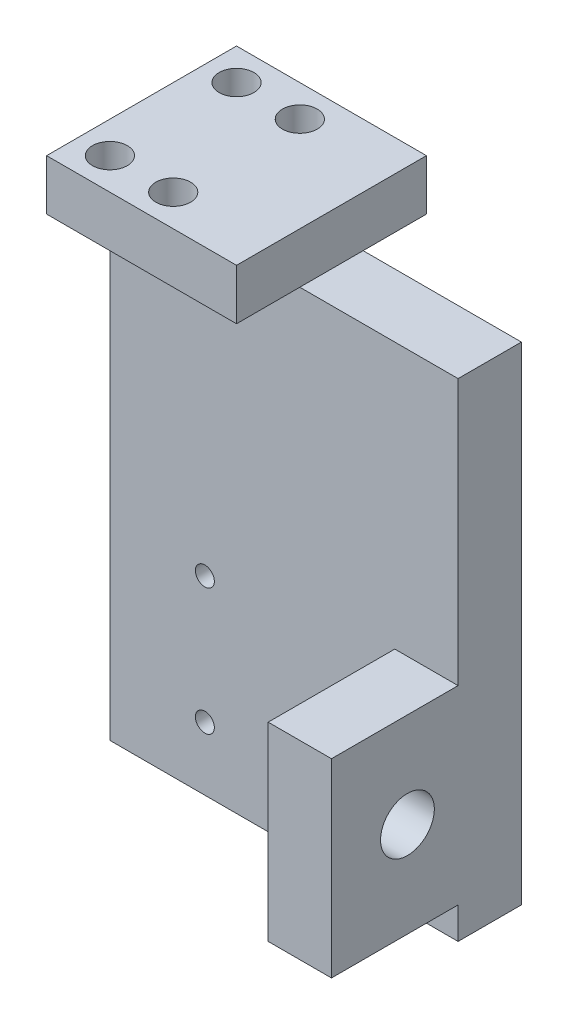
ISO-10303-21;
HEADER;
FILE_DESCRIPTION(('STEP AP214'),'2;1');
FILE_NAME('part.step','',(''),(''),'','','');
FILE_SCHEMA(('AUTOMOTIVE_DESIGN { 1 0 10303 214 1 1 1 1 }'));
ENDSEC;
DATA;
#1=APPLICATION_CONTEXT('core data for automotive mechanical design processes');
#2=APPLICATION_PROTOCOL_DEFINITION('international standard','automotive_design',2000,#1);
#3=PRODUCT_CONTEXT('',#1,'mechanical');
#4=PRODUCT('Part','Part','',(#3));
#5=PRODUCT_RELATED_PRODUCT_CATEGORY('part','',(#4));
#6=PRODUCT_DEFINITION_FORMATION('','',#4);
#7=PRODUCT_DEFINITION_CONTEXT('part definition',#1,'design');
#8=PRODUCT_DEFINITION('design','',#6,#7);
#9=PRODUCT_DEFINITION_SHAPE('','',#8);
#10=(LENGTH_UNIT() NAMED_UNIT(*) SI_UNIT(.MILLI.,.METRE.));
#11=(NAMED_UNIT(*) PLANE_ANGLE_UNIT() SI_UNIT($,.RADIAN.));
#12=(NAMED_UNIT(*) SI_UNIT($,.STERADIAN.) SOLID_ANGLE_UNIT());
#13=UNCERTAINTY_MEASURE_WITH_UNIT(LENGTH_MEASURE(1.E-05),#10,'distance_accuracy_value','');
#14=(GEOMETRIC_REPRESENTATION_CONTEXT(3) GLOBAL_UNCERTAINTY_ASSIGNED_CONTEXT((#13)) GLOBAL_UNIT_ASSIGNED_CONTEXT((#10,
#11,#12)) REPRESENTATION_CONTEXT('',''));
#15=CARTESIAN_POINT('',(0.,0.,0.));
#16=DIRECTION('',(0.,0.,1.));
#17=DIRECTION('',(1.,0.,0.));
#18=AXIS2_PLACEMENT_3D('',#15,#16,#17);
#19=CARTESIAN_POINT('',(5.,77.,25.));
#20=DIRECTION('',(0.,1.,0.));
#21=DIRECTION('',(0.,0.,1.));
#22=AXIS2_PLACEMENT_3D('',#19,#20,#21);
#23=CYLINDRICAL_SURFACE('',#22,2.75);
#24=CARTESIAN_POINT('',(5.,77.,25.));
#25=DIRECTION('',(0.,1.,0.));
#26=DIRECTION('',(0.,0.,1.));
#27=AXIS2_PLACEMENT_3D('',#24,#25,#26);
#28=CIRCLE('',#27,2.75);
#29=CARTESIAN_POINT('',(5.,77.,27.75));
#30=VERTEX_POINT('',#29);
#31=EDGE_CURVE('E144',#30,#30,#28,.F.);
#32=ORIENTED_EDGE('',*,*,#31,.T.);
#33=EDGE_LOOP('',(#32));
#34=FACE_BOUND('',#33,.T.);
#35=CARTESIAN_POINT('',(5.,85.,25.));
#36=DIRECTION('',(0.,1.,0.));
#37=DIRECTION('',(0.,0.,1.));
#38=AXIS2_PLACEMENT_3D('',#35,#36,#37);
#39=CIRCLE('',#38,2.75);
#40=CARTESIAN_POINT('',(5.,85.,27.75));
#41=VERTEX_POINT('',#40);
#42=EDGE_CURVE('E19',#41,#41,#39,.F.);
#43=ORIENTED_EDGE('',*,*,#42,.F.);
#44=EDGE_LOOP('',(#43));
#45=FACE_BOUND('',#44,.T.);
#46=ADVANCED_FACE('F16',(#34,#45),#23,.F.);
#47=CARTESIAN_POINT('',(15.,77.,25.));
#48=DIRECTION('',(0.,1.,0.));
#49=DIRECTION('',(0.,0.,1.));
#50=AXIS2_PLACEMENT_3D('',#47,#48,#49);
#51=CYLINDRICAL_SURFACE('',#50,2.75);
#52=CARTESIAN_POINT('',(15.,77.,25.));
#53=DIRECTION('',(0.,1.,0.));
#54=DIRECTION('',(0.,0.,1.));
#55=AXIS2_PLACEMENT_3D('',#52,#53,#54);
#56=CIRCLE('',#55,2.75);
#57=CARTESIAN_POINT('',(15.,77.,27.75));
#58=VERTEX_POINT('',#57);
#59=EDGE_CURVE('E125',#58,#58,#56,.F.);
#60=ORIENTED_EDGE('',*,*,#59,.T.);
#61=EDGE_LOOP('',(#60));
#62=FACE_BOUND('',#61,.T.);
#63=CARTESIAN_POINT('',(15.,85.,25.));
#64=DIRECTION('',(0.,1.,0.));
#65=DIRECTION('',(0.,0.,1.));
#66=AXIS2_PLACEMENT_3D('',#63,#64,#65);
#67=CIRCLE('',#66,2.75);
#68=CARTESIAN_POINT('',(15.,85.,27.75));
#69=VERTEX_POINT('',#68);
#70=EDGE_CURVE('E145',#69,#69,#67,.F.);
#71=ORIENTED_EDGE('',*,*,#70,.F.);
#72=EDGE_LOOP('',(#71));
#73=FACE_BOUND('',#72,.T.);
#74=ADVANCED_FACE('F191',(#62,#73),#51,.F.);
#75=CARTESIAN_POINT('',(45.,5.,40.));
#76=DIRECTION('',(0.,0.,1.));
#77=DIRECTION('',(1.,0.,0.));
#78=AXIS2_PLACEMENT_3D('',#75,#76,#77);
#79=PLANE('',#78);
#80=DIRECTION('',(0.,1.,0.));
#81=VECTOR('',#80,1.);
#82=CARTESIAN_POINT('',(55.,5.,40.));
#83=LINE('',#82,#81);
#84=CARTESIAN_POINT('',(55.,35.,40.));
#85=VERTEX_POINT('',#84);
#86=CARTESIAN_POINT('',(55.,5.,40.));
#87=VERTEX_POINT('',#86);
#88=EDGE_CURVE('E176',#85,#87,#83,.F.);
#89=ORIENTED_EDGE('',*,*,#88,.F.);
#90=DIRECTION('',(1.,0.,0.));
#91=VECTOR('',#90,1.);
#92=CARTESIAN_POINT('',(45.,35.,40.));
#93=LINE('',#92,#91);
#94=CARTESIAN_POINT('',(45.,35.,40.));
#95=VERTEX_POINT('',#94);
#96=EDGE_CURVE('E132',#95,#85,#93,.T.);
#97=ORIENTED_EDGE('',*,*,#96,.F.);
#98=DIRECTION('',(0.,1.,0.));
#99=VECTOR('',#98,1.);
#100=CARTESIAN_POINT('',(45.,5.,40.));
#101=LINE('',#100,#99);
#102=CARTESIAN_POINT('',(45.,5.,40.));
#103=VERTEX_POINT('',#102);
#104=EDGE_CURVE('E110',#95,#103,#101,.F.);
#105=ORIENTED_EDGE('',*,*,#104,.T.);
#106=DIRECTION('',(1.,0.,0.));
#107=VECTOR('',#106,1.);
#108=CARTESIAN_POINT('',(45.,5.,40.));
#109=LINE('',#108,#107);
#110=EDGE_CURVE('E116',#103,#87,#109,.T.);
#111=ORIENTED_EDGE('',*,*,#110,.T.);
#112=EDGE_LOOP('',(#89,#97,#105,#111));
#113=FACE_BOUND('',#112,.T.);
#114=ADVANCED_FACE('F131',(#113),#79,.T.);
#115=CARTESIAN_POINT('',(45.,20.,28.));
#116=DIRECTION('',(1.,0.,0.));
#117=DIRECTION('',(0.,0.,-1.));
#118=AXIS2_PLACEMENT_3D('',#115,#116,#117);
#119=CYLINDRICAL_SURFACE('',#118,4.25);
#120=CARTESIAN_POINT('',(45.,20.,28.));
#121=DIRECTION('',(1.,0.,0.));
#122=DIRECTION('',(0.,0.,-1.));
#123=AXIS2_PLACEMENT_3D('',#120,#121,#122);
#124=CIRCLE('',#123,4.25);
#125=CARTESIAN_POINT('',(45.,20.,23.75));
#126=VERTEX_POINT('',#125);
#127=EDGE_CURVE('E133',#126,#126,#124,.F.);
#128=ORIENTED_EDGE('',*,*,#127,.T.);
#129=EDGE_LOOP('',(#128));
#130=FACE_BOUND('',#129,.T.);
#131=CARTESIAN_POINT('',(55.,20.,28.));
#132=DIRECTION('',(1.,0.,0.));
#133=DIRECTION('',(0.,0.,-1.));
#134=AXIS2_PLACEMENT_3D('',#131,#132,#133);
#135=CIRCLE('',#134,4.25);
#136=CARTESIAN_POINT('',(55.,20.,23.75));
#137=VERTEX_POINT('',#136);
#138=EDGE_CURVE('E173',#137,#137,#135,.F.);
#139=ORIENTED_EDGE('',*,*,#138,.F.);
#140=EDGE_LOOP('',(#139));
#141=FACE_BOUND('',#140,.T.);
#142=ADVANCED_FACE('F273',(#130,#141),#119,.F.);
#143=CARTESIAN_POINT('',(0.,77.,30.));
#144=DIRECTION('',(0.,0.,1.));
#145=DIRECTION('',(1.,0.,0.));
#146=AXIS2_PLACEMENT_3D('',#143,#144,#145);
#147=PLANE('',#146);
#148=DIRECTION('',(0.,1.,0.));
#149=VECTOR('',#148,1.);
#150=CARTESIAN_POINT('',(30.,77.,30.));
#151=LINE('',#150,#149);
#152=CARTESIAN_POINT('',(30.,85.,30.));
#153=VERTEX_POINT('',#152);
#154=CARTESIAN_POINT('',(30.,77.,30.));
#155=VERTEX_POINT('',#154);
#156=EDGE_CURVE('E425',#153,#155,#151,.F.);
#157=ORIENTED_EDGE('',*,*,#156,.F.);
#158=DIRECTION('',(1.,0.,0.));
#159=VECTOR('',#158,1.);
#160=CARTESIAN_POINT('',(0.,85.,30.));
#161=LINE('',#160,#159);
#162=CARTESIAN_POINT('',(0.,85.,30.));
#163=VERTEX_POINT('',#162);
#164=EDGE_CURVE('E146',#163,#153,#161,.T.);
#165=ORIENTED_EDGE('',*,*,#164,.F.);
#166=DIRECTION('',(0.,1.,0.));
#167=VECTOR('',#166,1.);
#168=CARTESIAN_POINT('',(0.,77.,30.));
#169=LINE('',#168,#167);
#170=CARTESIAN_POINT('',(0.,77.,30.));
#171=VERTEX_POINT('',#170);
#172=EDGE_CURVE('E459',#163,#171,#169,.F.);
#173=ORIENTED_EDGE('',*,*,#172,.T.);
#174=DIRECTION('',(1.,0.,0.));
#175=VECTOR('',#174,1.);
#176=CARTESIAN_POINT('',(0.,77.,30.));
#177=LINE('',#176,#175);
#178=EDGE_CURVE('E141',#171,#155,#177,.T.);
#179=ORIENTED_EDGE('',*,*,#178,.T.);
#180=EDGE_LOOP('',(#157,#165,#173,#179));
#181=FACE_BOUND('',#180,.T.);
#182=ADVANCED_FACE('F270',(#181),#147,.T.);
#183=CARTESIAN_POINT('',(0.,85.,0.));
#184=DIRECTION('',(0.,1.,0.));
#185=DIRECTION('',(0.,0.,1.));
#186=AXIS2_PLACEMENT_3D('',#183,#184,#185);
#187=PLANE('',#186);
#188=ORIENTED_EDGE('',*,*,#70,.T.);
#189=EDGE_LOOP('',(#188));
#190=FACE_BOUND('',#189,.T.);
#191=CARTESIAN_POINT('',(15.,85.,5.));
#192=DIRECTION('',(0.,1.,0.));
#193=DIRECTION('',(0.,0.,1.));
#194=AXIS2_PLACEMENT_3D('',#191,#192,#193);
#195=CIRCLE('',#194,2.75);
#196=CARTESIAN_POINT('',(15.,85.,7.75));
#197=VERTEX_POINT('',#196);
#198=EDGE_CURVE('E165',#197,#197,#195,.F.);
#199=ORIENTED_EDGE('',*,*,#198,.T.);
#200=EDGE_LOOP('',(#199));
#201=FACE_BOUND('',#200,.T.);
#202=ORIENTED_EDGE('',*,*,#42,.T.);
#203=EDGE_LOOP('',(#202));
#204=FACE_BOUND('',#203,.T.);
#205=CARTESIAN_POINT('',(5.,85.,5.));
#206=DIRECTION('',(0.,1.,0.));
#207=DIRECTION('',(0.,0.,1.));
#208=AXIS2_PLACEMENT_3D('',#205,#206,#207);
#209=CIRCLE('',#208,2.75);
#210=CARTESIAN_POINT('',(5.,85.,7.75));
#211=VERTEX_POINT('',#210);
#212=EDGE_CURVE('E169',#211,#211,#209,.F.);
#213=ORIENTED_EDGE('',*,*,#212,.T.);
#214=EDGE_LOOP('',(#213));
#215=FACE_BOUND('',#214,.T.);
#216=ORIENTED_EDGE('',*,*,#164,.T.);
#217=DIRECTION('',(0.,0.,-1.));
#218=VECTOR('',#217,1.);
#219=CARTESIAN_POINT('',(30.,85.,0.));
#220=LINE('',#219,#218);
#221=CARTESIAN_POINT('',(30.,85.,0.));
#222=VERTEX_POINT('',#221);
#223=EDGE_CURVE('E175',#222,#153,#220,.F.);
#224=ORIENTED_EDGE('',*,*,#223,.F.);
#225=DIRECTION('',(1.,0.,0.));
#226=VECTOR('',#225,1.);
#227=CARTESIAN_POINT('',(0.,85.,0.));
#228=LINE('',#227,#226);
#229=CARTESIAN_POINT('',(0.,85.,0.));
#230=VERTEX_POINT('',#229);
#231=EDGE_CURVE('E467',#222,#230,#228,.F.);
#232=ORIENTED_EDGE('',*,*,#231,.T.);
#233=DIRECTION('',(0.,0.,-1.));
#234=VECTOR('',#233,1.);
#235=CARTESIAN_POINT('',(0.,85.,0.));
#236=LINE('',#235,#234);
#237=EDGE_CURVE('E461',#230,#163,#236,.F.);
#238=ORIENTED_EDGE('',*,*,#237,.T.);
#239=EDGE_LOOP('',(#216,#224,#232,#238));
#240=FACE_BOUND('',#239,.T.);
#241=ADVANCED_FACE('F187',(#190,#201,#204,#215,#240),#187,.T.);
#242=CARTESIAN_POINT('',(0.,77.,0.));
#243=DIRECTION('',(0.,1.,0.));
#244=DIRECTION('',(0.,0.,1.));
#245=AXIS2_PLACEMENT_3D('',#242,#243,#244);
#246=PLANE('',#245);
#247=ORIENTED_EDGE('',*,*,#59,.F.);
#248=EDGE_LOOP('',(#247));
#249=FACE_BOUND('',#248,.T.);
#250=ORIENTED_EDGE('',*,*,#31,.F.);
#251=EDGE_LOOP('',(#250));
#252=FACE_BOUND('',#251,.T.);
#253=DIRECTION('',(0.,0.,-1.));
#254=VECTOR('',#253,1.);
#255=CARTESIAN_POINT('',(0.,77.,0.));
#256=LINE('',#255,#254);
#257=CARTESIAN_POINT('',(0.,77.,20.));
#258=VERTEX_POINT('',#257);
#259=EDGE_CURVE('E172',#171,#258,#256,.T.);
#260=ORIENTED_EDGE('',*,*,#259,.T.);
#261=DIRECTION('',(1.,0.,0.));
#262=VECTOR('',#261,1.);
#263=CARTESIAN_POINT('',(0.,77.,20.));
#264=LINE('',#263,#262);
#265=CARTESIAN_POINT('',(30.,77.,20.));
#266=VERTEX_POINT('',#265);
#267=EDGE_CURVE('E168',#266,#258,#264,.F.);
#268=ORIENTED_EDGE('',*,*,#267,.F.);
#269=DIRECTION('',(0.,0.,-1.));
#270=VECTOR('',#269,1.);
#271=CARTESIAN_POINT('',(30.,77.,0.));
#272=LINE('',#271,#270);
#273=EDGE_CURVE('E430',#155,#266,#272,.T.);
#274=ORIENTED_EDGE('',*,*,#273,.F.);
#275=ORIENTED_EDGE('',*,*,#178,.F.);
#276=EDGE_LOOP('',(#260,#268,#274,#275));
#277=FACE_BOUND('',#276,.T.);
#278=ADVANCED_FACE('F264',(#249,#252,#277),#246,.F.);
#279=CARTESIAN_POINT('',(45.,5.,20.));
#280=DIRECTION('',(0.,1.,0.));
#281=DIRECTION('',(0.,0.,1.));
#282=AXIS2_PLACEMENT_3D('',#279,#280,#281);
#283=PLANE('',#282);
#284=ORIENTED_EDGE('',*,*,#110,.F.);
#285=DIRECTION('',(0.,0.,-1.));
#286=VECTOR('',#285,1.);
#287=CARTESIAN_POINT('',(45.,5.,20.));
#288=LINE('',#287,#286);
#289=CARTESIAN_POINT('',(45.,5.,20.));
#290=VERTEX_POINT('',#289);
#291=EDGE_CURVE('E119',#103,#290,#288,.T.);
#292=ORIENTED_EDGE('',*,*,#291,.T.);
#293=DIRECTION('',(1.,0.,0.));
#294=VECTOR('',#293,1.);
#295=CARTESIAN_POINT('',(0.,5.,20.));
#296=LINE('',#295,#294);
#297=CARTESIAN_POINT('',(55.,5.,20.));
#298=VERTEX_POINT('',#297);
#299=EDGE_CURVE('E451',#298,#290,#296,.F.);
#300=ORIENTED_EDGE('',*,*,#299,.F.);
#301=DIRECTION('',(0.,0.,-1.));
#302=VECTOR('',#301,1.);
#303=CARTESIAN_POINT('',(55.,5.,20.));
#304=LINE('',#303,#302);
#305=EDGE_CURVE('E121',#87,#298,#304,.T.);
#306=ORIENTED_EDGE('',*,*,#305,.F.);
#307=EDGE_LOOP('',(#284,#292,#300,#306));
#308=FACE_BOUND('',#307,.T.);
#309=ADVANCED_FACE('F117',(#308),#283,.F.);
#310=CARTESIAN_POINT('',(45.,5.,20.));
#311=DIRECTION('',(1.,0.,0.));
#312=DIRECTION('',(0.,0.,-1.));
#313=AXIS2_PLACEMENT_3D('',#310,#311,#312);
#314=PLANE('',#313);
#315=ORIENTED_EDGE('',*,*,#127,.F.);
#316=EDGE_LOOP('',(#315));
#317=FACE_BOUND('',#316,.T.);
#318=DIRECTION('',(0.,0.,1.));
#319=VECTOR('',#318,1.);
#320=CARTESIAN_POINT('',(45.,35.,20.));
#321=LINE('',#320,#319);
#322=CARTESIAN_POINT('',(45.,35.,20.));
#323=VERTEX_POINT('',#322);
#324=EDGE_CURVE('E136',#323,#95,#321,.T.);
#325=ORIENTED_EDGE('',*,*,#324,.F.);
#326=DIRECTION('',(0.,1.,0.));
#327=VECTOR('',#326,1.);
#328=CARTESIAN_POINT('',(45.,0.,20.));
#329=LINE('',#328,#327);
#330=EDGE_CURVE('E128',#290,#323,#329,.T.);
#331=ORIENTED_EDGE('',*,*,#330,.F.);
#332=ORIENTED_EDGE('',*,*,#291,.F.);
#333=ORIENTED_EDGE('',*,*,#104,.F.);
#334=EDGE_LOOP('',(#325,#331,#332,#333));
#335=FACE_BOUND('',#334,.T.);
#336=ADVANCED_FACE('F127',(#317,#335),#314,.F.);
#337=CARTESIAN_POINT('',(45.,35.,20.));
#338=DIRECTION('',(0.,1.,0.));
#339=DIRECTION('',(0.,0.,1.));
#340=AXIS2_PLACEMENT_3D('',#337,#338,#339);
#341=PLANE('',#340);
#342=ORIENTED_EDGE('',*,*,#96,.T.);
#343=DIRECTION('',(0.,0.,-1.));
#344=VECTOR('',#343,1.);
#345=CARTESIAN_POINT('',(55.,35.,20.));
#346=LINE('',#345,#344);
#347=CARTESIAN_POINT('',(55.,35.,20.));
#348=VERTEX_POINT('',#347);
#349=EDGE_CURVE('E438',#348,#85,#346,.F.);
#350=ORIENTED_EDGE('',*,*,#349,.F.);
#351=DIRECTION('',(1.,0.,0.));
#352=VECTOR('',#351,1.);
#353=CARTESIAN_POINT('',(0.,35.,20.));
#354=LINE('',#353,#352);
#355=EDGE_CURVE('E443',#323,#348,#354,.T.);
#356=ORIENTED_EDGE('',*,*,#355,.F.);
#357=ORIENTED_EDGE('',*,*,#324,.T.);
#358=EDGE_LOOP('',(#342,#350,#356,#357));
#359=FACE_BOUND('',#358,.T.);
#360=ADVANCED_FACE('F254',(#359),#341,.T.);
#361=CARTESIAN_POINT('',(30.,77.,0.));
#362=DIRECTION('',(1.,0.,0.));
#363=DIRECTION('',(0.,0.,-1.));
#364=AXIS2_PLACEMENT_3D('',#361,#362,#363);
#365=PLANE('',#364);
#366=ORIENTED_EDGE('',*,*,#273,.T.);
#367=DIRECTION('',(0.,0.,1.));
#368=VECTOR('',#367,1.);
#369=CARTESIAN_POINT('',(30.,77.,10.));
#370=LINE('',#369,#368);
#371=CARTESIAN_POINT('',(30.,77.,10.));
#372=VERTEX_POINT('',#371);
#373=EDGE_CURVE('E483',#372,#266,#370,.T.);
#374=ORIENTED_EDGE('',*,*,#373,.F.);
#375=DIRECTION('',(0.,0.,1.));
#376=VECTOR('',#375,1.);
#377=CARTESIAN_POINT('',(30.,77.,0.));
#378=LINE('',#377,#376);
#379=CARTESIAN_POINT('',(30.,77.,0.));
#380=VERTEX_POINT('',#379);
#381=EDGE_CURVE('E34',#372,#380,#378,.F.);
#382=ORIENTED_EDGE('',*,*,#381,.T.);
#383=DIRECTION('',(0.,1.,0.));
#384=VECTOR('',#383,1.);
#385=CARTESIAN_POINT('',(30.,77.,0.));
#386=LINE('',#385,#384);
#387=EDGE_CURVE('E432',#380,#222,#386,.T.);
#388=ORIENTED_EDGE('',*,*,#387,.T.);
#389=ORIENTED_EDGE('',*,*,#223,.T.);
#390=ORIENTED_EDGE('',*,*,#156,.T.);
#391=EDGE_LOOP('',(#366,#374,#382,#388,#389,#390));
#392=FACE_BOUND('',#391,.T.);
#393=ADVANCED_FACE('F250',(#392),#365,.T.);
#394=CARTESIAN_POINT('',(0.,77.,0.));
#395=DIRECTION('',(0.,0.,1.));
#396=DIRECTION('',(1.,0.,0.));
#397=AXIS2_PLACEMENT_3D('',#394,#395,#396);
#398=PLANE('',#397);
#399=ORIENTED_EDGE('',*,*,#387,.F.);
#400=DIRECTION('',(1.,0.,0.));
#401=VECTOR('',#400,1.);
#402=CARTESIAN_POINT('',(0.,77.,0.));
#403=LINE('',#402,#401);
#404=CARTESIAN_POINT('',(0.,77.,0.));
#405=VERTEX_POINT('',#404);
#406=EDGE_CURVE('E471',#380,#405,#403,.F.);
#407=ORIENTED_EDGE('',*,*,#406,.T.);
#408=DIRECTION('',(0.,1.,0.));
#409=VECTOR('',#408,1.);
#410=CARTESIAN_POINT('',(0.,77.,0.));
#411=LINE('',#410,#409);
#412=EDGE_CURVE('E464',#405,#230,#411,.T.);
#413=ORIENTED_EDGE('',*,*,#412,.T.);
#414=ORIENTED_EDGE('',*,*,#231,.F.);
#415=EDGE_LOOP('',(#399,#407,#413,#414));
#416=FACE_BOUND('',#415,.T.);
#417=ADVANCED_FACE('F246',(#416),#398,.F.);
#418=CARTESIAN_POINT('',(5.,77.,5.));
#419=DIRECTION('',(0.,1.,0.));
#420=DIRECTION('',(0.,0.,1.));
#421=AXIS2_PLACEMENT_3D('',#418,#419,#420);
#422=CYLINDRICAL_SURFACE('',#421,2.75);
#423=CARTESIAN_POINT('',(5.,77.,5.));
#424=DIRECTION('',(0.,1.,0.));
#425=DIRECTION('',(0.,0.,1.));
#426=AXIS2_PLACEMENT_3D('',#423,#424,#425);
#427=CIRCLE('',#426,2.75);
#428=CARTESIAN_POINT('',(5.,77.,7.75));
#429=VERTEX_POINT('',#428);
#430=EDGE_CURVE('E161',#429,#429,#427,.F.);
#431=ORIENTED_EDGE('',*,*,#430,.T.);
#432=EDGE_LOOP('',(#431));
#433=FACE_BOUND('',#432,.T.);
#434=ORIENTED_EDGE('',*,*,#212,.F.);
#435=EDGE_LOOP('',(#434));
#436=FACE_BOUND('',#435,.T.);
#437=ADVANCED_FACE('F242',(#433,#436),#422,.F.);
#438=CARTESIAN_POINT('',(15.,77.,5.));
#439=DIRECTION('',(0.,1.,0.));
#440=DIRECTION('',(0.,0.,1.));
#441=AXIS2_PLACEMENT_3D('',#438,#439,#440);
#442=CYLINDRICAL_SURFACE('',#441,2.75);
#443=CARTESIAN_POINT('',(15.,77.,5.));
#444=DIRECTION('',(0.,1.,0.));
#445=DIRECTION('',(0.,0.,1.));
#446=AXIS2_PLACEMENT_3D('',#443,#444,#445);
#447=CIRCLE('',#446,2.75);
#448=CARTESIAN_POINT('',(15.,77.,7.75));
#449=VERTEX_POINT('',#448);
#450=EDGE_CURVE('E158',#449,#449,#447,.F.);
#451=ORIENTED_EDGE('',*,*,#450,.T.);
#452=EDGE_LOOP('',(#451));
#453=FACE_BOUND('',#452,.T.);
#454=ORIENTED_EDGE('',*,*,#198,.F.);
#455=EDGE_LOOP('',(#454));
#456=FACE_BOUND('',#455,.T.);
#457=ADVANCED_FACE('F238',(#453,#456),#442,.F.);
#458=CARTESIAN_POINT('',(0.,0.,20.));
#459=DIRECTION('',(0.,0.,1.));
#460=DIRECTION('',(1.,0.,0.));
#461=AXIS2_PLACEMENT_3D('',#458,#459,#460);
#462=PLANE('',#461);
#463=CARTESIAN_POINT('',(15.,30.,20.));
#464=DIRECTION('',(0.,0.,1.));
#465=DIRECTION('',(1.,0.,0.));
#466=AXIS2_PLACEMENT_3D('',#463,#464,#465);
#467=CIRCLE('',#466,1.5);
#468=CARTESIAN_POINT('',(16.5,30.,20.));
#469=VERTEX_POINT('',#468);
#470=EDGE_CURVE('E151',#469,#469,#467,.F.);
#471=ORIENTED_EDGE('',*,*,#470,.T.);
#472=EDGE_LOOP('',(#471));
#473=FACE_BOUND('',#472,.T.);
#474=CARTESIAN_POINT('',(15.,10.,20.));
#475=DIRECTION('',(0.,0.,1.));
#476=DIRECTION('',(1.,0.,0.));
#477=AXIS2_PLACEMENT_3D('',#474,#475,#476);
#478=CIRCLE('',#477,1.5);
#479=CARTESIAN_POINT('',(16.5,10.,20.));
#480=VERTEX_POINT('',#479);
#481=EDGE_CURVE('E155',#480,#480,#478,.F.);
#482=ORIENTED_EDGE('',*,*,#481,.T.);
#483=EDGE_LOOP('',(#482));
#484=FACE_BOUND('',#483,.T.);
#485=DIRECTION('',(0.,1.,0.));
#486=VECTOR('',#485,1.);
#487=CARTESIAN_POINT('',(55.,0.,20.));
#488=LINE('',#487,#486);
#489=CARTESIAN_POINT('',(55.,77.,20.));
#490=VERTEX_POINT('',#489);
#491=EDGE_CURVE('E489',#490,#348,#488,.F.);
#492=ORIENTED_EDGE('',*,*,#491,.F.);
#493=DIRECTION('',(1.,0.,0.));
#494=VECTOR('',#493,1.);
#495=CARTESIAN_POINT('',(0.,77.,20.));
#496=LINE('',#495,#494);
#497=EDGE_CURVE('E481',#266,#490,#496,.T.);
#498=ORIENTED_EDGE('',*,*,#497,.F.);
#499=ORIENTED_EDGE('',*,*,#267,.T.);
#500=DIRECTION('',(0.,1.,0.));
#501=VECTOR('',#500,1.);
#502=CARTESIAN_POINT('',(0.,0.,20.));
#503=LINE('',#502,#501);
#504=CARTESIAN_POINT('',(0.,0.,20.));
#505=VERTEX_POINT('',#504);
#506=EDGE_CURVE('E447',#258,#505,#503,.F.);
#507=ORIENTED_EDGE('',*,*,#506,.T.);
#508=DIRECTION('',(1.,0.,0.));
#509=VECTOR('',#508,1.);
#510=CARTESIAN_POINT('',(0.,0.,20.));
#511=LINE('',#510,#509);
#512=CARTESIAN_POINT('',(55.,0.,20.));
#513=VERTEX_POINT('',#512);
#514=EDGE_CURVE('E493',#505,#513,#511,.T.);
#515=ORIENTED_EDGE('',*,*,#514,.T.);
#516=DIRECTION('',(0.,1.,0.));
#517=VECTOR('',#516,1.);
#518=CARTESIAN_POINT('',(55.,0.,20.));
#519=LINE('',#518,#517);
#520=EDGE_CURVE('E486',#298,#513,#519,.F.);
#521=ORIENTED_EDGE('',*,*,#520,.F.);
#522=ORIENTED_EDGE('',*,*,#299,.T.);
#523=ORIENTED_EDGE('',*,*,#330,.T.);
#524=ORIENTED_EDGE('',*,*,#355,.T.);
#525=EDGE_LOOP('',(#492,#498,#499,#507,#515,#521,#522,#523,#524));
#526=FACE_BOUND('',#525,.T.);
#527=ADVANCED_FACE('F234',(#473,#484,#526),#462,.T.);
#528=CARTESIAN_POINT('',(0.,0.,10.));
#529=DIRECTION('',(1.,0.,0.));
#530=DIRECTION('',(0.,0.,-1.));
#531=AXIS2_PLACEMENT_3D('',#528,#529,#530);
#532=PLANE('',#531);
#533=ORIENTED_EDGE('',*,*,#506,.F.);
#534=ORIENTED_EDGE('',*,*,#259,.F.);
#535=ORIENTED_EDGE('',*,*,#172,.F.);
#536=ORIENTED_EDGE('',*,*,#237,.F.);
#537=ORIENTED_EDGE('',*,*,#412,.F.);
#538=DIRECTION('',(0.,0.,1.));
#539=VECTOR('',#538,1.);
#540=CARTESIAN_POINT('',(0.,77.,0.));
#541=LINE('',#540,#539);
#542=CARTESIAN_POINT('',(0.,77.,10.));
#543=VERTEX_POINT('',#542);
#544=EDGE_CURVE('E164',#405,#543,#541,.T.);
#545=ORIENTED_EDGE('',*,*,#544,.T.);
#546=DIRECTION('',(0.,1.,0.));
#547=VECTOR('',#546,1.);
#548=CARTESIAN_POINT('',(0.,0.,10.));
#549=LINE('',#548,#547);
#550=CARTESIAN_POINT('',(0.,0.,10.));
#551=VERTEX_POINT('',#550);
#552=EDGE_CURVE('E154',#543,#551,#549,.F.);
#553=ORIENTED_EDGE('',*,*,#552,.T.);
#554=DIRECTION('',(0.,0.,1.));
#555=VECTOR('',#554,1.);
#556=CARTESIAN_POINT('',(0.,0.,10.));
#557=LINE('',#556,#555);
#558=EDGE_CURVE('E449',#551,#505,#557,.T.);
#559=ORIENTED_EDGE('',*,*,#558,.T.);
#560=EDGE_LOOP('',(#533,#534,#535,#536,#537,#545,#553,#559));
#561=FACE_BOUND('',#560,.T.);
#562=ADVANCED_FACE('F230',(#561),#532,.F.);
#563=CARTESIAN_POINT('',(0.,0.,10.));
#564=DIRECTION('',(0.,1.,0.));
#565=DIRECTION('',(0.,0.,1.));
#566=AXIS2_PLACEMENT_3D('',#563,#564,#565);
#567=PLANE('',#566);
#568=ORIENTED_EDGE('',*,*,#514,.F.);
#569=ORIENTED_EDGE('',*,*,#558,.F.);
#570=DIRECTION('',(1.,0.,0.));
#571=VECTOR('',#570,1.);
#572=CARTESIAN_POINT('',(0.,0.,10.));
#573=LINE('',#572,#571);
#574=CARTESIAN_POINT('',(55.,0.,10.));
#575=VERTEX_POINT('',#574);
#576=EDGE_CURVE('E502',#551,#575,#573,.T.);
#577=ORIENTED_EDGE('',*,*,#576,.T.);
#578=DIRECTION('',(0.,0.,-1.));
#579=VECTOR('',#578,1.);
#580=CARTESIAN_POINT('',(55.,0.,10.));
#581=LINE('',#580,#579);
#582=EDGE_CURVE('E491',#513,#575,#581,.T.);
#583=ORIENTED_EDGE('',*,*,#582,.F.);
#584=EDGE_LOOP('',(#568,#569,#577,#583));
#585=FACE_BOUND('',#584,.T.);
#586=ADVANCED_FACE('F226',(#585),#567,.F.);
#587=CARTESIAN_POINT('',(55.,0.,10.));
#588=DIRECTION('',(1.,0.,0.));
#589=DIRECTION('',(0.,0.,-1.));
#590=AXIS2_PLACEMENT_3D('',#587,#588,#589);
#591=PLANE('',#590);
#592=ORIENTED_EDGE('',*,*,#491,.T.);
#593=ORIENTED_EDGE('',*,*,#349,.T.);
#594=ORIENTED_EDGE('',*,*,#88,.T.);
#595=ORIENTED_EDGE('',*,*,#305,.T.);
#596=ORIENTED_EDGE('',*,*,#520,.T.);
#597=ORIENTED_EDGE('',*,*,#582,.T.);
#598=DIRECTION('',(0.,1.,0.));
#599=VECTOR('',#598,1.);
#600=CARTESIAN_POINT('',(55.,0.,10.));
#601=LINE('',#600,#599);
#602=CARTESIAN_POINT('',(55.,77.,10.));
#603=VERTEX_POINT('',#602);
#604=EDGE_CURVE('E508',#575,#603,#601,.T.);
#605=ORIENTED_EDGE('',*,*,#604,.T.);
#606=DIRECTION('',(0.,0.,1.));
#607=VECTOR('',#606,1.);
#608=CARTESIAN_POINT('',(55.,77.,10.));
#609=LINE('',#608,#607);
#610=EDGE_CURVE('E476',#490,#603,#609,.F.);
#611=ORIENTED_EDGE('',*,*,#610,.F.);
#612=EDGE_LOOP('',(#592,#593,#594,#595,#596,#597,#605,#611));
#613=FACE_BOUND('',#612,.T.);
#614=ORIENTED_EDGE('',*,*,#138,.T.);
#615=EDGE_LOOP('',(#614));
#616=FACE_BOUND('',#615,.T.);
#617=ADVANCED_FACE('F222',(#613,#616),#591,.T.);
#618=CARTESIAN_POINT('',(0.,77.,10.));
#619=DIRECTION('',(0.,1.,0.));
#620=DIRECTION('',(0.,0.,1.));
#621=AXIS2_PLACEMENT_3D('',#618,#619,#620);
#622=PLANE('',#621);
#623=ORIENTED_EDGE('',*,*,#497,.T.);
#624=ORIENTED_EDGE('',*,*,#610,.T.);
#625=DIRECTION('',(1.,0.,0.));
#626=VECTOR('',#625,1.);
#627=CARTESIAN_POINT('',(0.,77.,10.));
#628=LINE('',#627,#626);
#629=EDGE_CURVE('E510',#603,#372,#628,.F.);
#630=ORIENTED_EDGE('',*,*,#629,.T.);
#631=ORIENTED_EDGE('',*,*,#373,.T.);
#632=EDGE_LOOP('',(#623,#624,#630,#631));
#633=FACE_BOUND('',#632,.T.);
#634=ADVANCED_FACE('F218',(#633),#622,.T.);
#635=CARTESIAN_POINT('',(0.,77.,0.));
#636=DIRECTION('',(0.,1.,0.));
#637=DIRECTION('',(0.,0.,1.));
#638=AXIS2_PLACEMENT_3D('',#635,#636,#637);
#639=PLANE('',#638);
#640=ORIENTED_EDGE('',*,*,#450,.F.);
#641=EDGE_LOOP('',(#640));
#642=FACE_BOUND('',#641,.T.);
#643=ORIENTED_EDGE('',*,*,#430,.F.);
#644=EDGE_LOOP('',(#643));
#645=FACE_BOUND('',#644,.T.);
#646=ORIENTED_EDGE('',*,*,#544,.F.);
#647=ORIENTED_EDGE('',*,*,#406,.F.);
#648=ORIENTED_EDGE('',*,*,#381,.F.);
#649=DIRECTION('',(1.,0.,0.));
#650=VECTOR('',#649,1.);
#651=CARTESIAN_POINT('',(0.,77.,10.));
#652=LINE('',#651,#650);
#653=EDGE_CURVE('E150',#372,#543,#652,.F.);
#654=ORIENTED_EDGE('',*,*,#653,.T.);
#655=EDGE_LOOP('',(#646,#647,#648,#654));
#656=FACE_BOUND('',#655,.T.);
#657=ADVANCED_FACE('F214',(#642,#645,#656),#639,.F.);
#658=CARTESIAN_POINT('',(15.,10.,10.));
#659=DIRECTION('',(0.,0.,1.));
#660=DIRECTION('',(1.,0.,0.));
#661=AXIS2_PLACEMENT_3D('',#658,#659,#660);
#662=CYLINDRICAL_SURFACE('',#661,1.5);
#663=CARTESIAN_POINT('',(15.,10.,10.));
#664=DIRECTION('',(0.,0.,1.));
#665=DIRECTION('',(1.,0.,0.));
#666=AXIS2_PLACEMENT_3D('',#663,#664,#665);
#667=CIRCLE('',#666,1.5);
#668=CARTESIAN_POINT('',(16.5,10.,10.));
#669=VERTEX_POINT('',#668);
#670=EDGE_CURVE('E25',#669,#669,#667,.F.);
#671=ORIENTED_EDGE('',*,*,#670,.T.);
#672=EDGE_LOOP('',(#671));
#673=FACE_BOUND('',#672,.T.);
#674=ORIENTED_EDGE('',*,*,#481,.F.);
#675=EDGE_LOOP('',(#674));
#676=FACE_BOUND('',#675,.T.);
#677=ADVANCED_FACE('F206',(#673,#676),#662,.F.);
#678=CARTESIAN_POINT('',(15.,30.,10.));
#679=DIRECTION('',(0.,0.,1.));
#680=DIRECTION('',(1.,0.,0.));
#681=AXIS2_PLACEMENT_3D('',#678,#679,#680);
#682=CYLINDRICAL_SURFACE('',#681,1.5);
#683=CARTESIAN_POINT('',(15.,30.,10.));
#684=DIRECTION('',(0.,0.,1.));
#685=DIRECTION('',(1.,0.,0.));
#686=AXIS2_PLACEMENT_3D('',#683,#684,#685);
#687=CIRCLE('',#686,1.5);
#688=CARTESIAN_POINT('',(16.5,30.,10.));
#689=VERTEX_POINT('',#688);
#690=EDGE_CURVE('E11',#689,#689,#687,.F.);
#691=ORIENTED_EDGE('',*,*,#690,.T.);
#692=EDGE_LOOP('',(#691));
#693=FACE_BOUND('',#692,.T.);
#694=ORIENTED_EDGE('',*,*,#470,.F.);
#695=EDGE_LOOP('',(#694));
#696=FACE_BOUND('',#695,.T.);
#697=ADVANCED_FACE('F200',(#693,#696),#682,.F.);
#698=CARTESIAN_POINT('',(0.,0.,10.));
#699=DIRECTION('',(0.,0.,1.));
#700=DIRECTION('',(1.,0.,0.));
#701=AXIS2_PLACEMENT_3D('',#698,#699,#700);
#702=PLANE('',#701);
#703=ORIENTED_EDGE('',*,*,#690,.F.);
#704=EDGE_LOOP('',(#703));
#705=FACE_BOUND('',#704,.T.);
#706=ORIENTED_EDGE('',*,*,#670,.F.);
#707=EDGE_LOOP('',(#706));
#708=FACE_BOUND('',#707,.T.);
#709=ORIENTED_EDGE('',*,*,#629,.F.);
#710=ORIENTED_EDGE('',*,*,#604,.F.);
#711=ORIENTED_EDGE('',*,*,#576,.F.);
#712=ORIENTED_EDGE('',*,*,#552,.F.);
#713=ORIENTED_EDGE('',*,*,#653,.F.);
#714=EDGE_LOOP('',(#709,#710,#711,#712,#713));
#715=FACE_BOUND('',#714,.T.);
#716=ADVANCED_FACE('F198',(#705,#708,#715),#702,.F.);
#717=CLOSED_SHELL('',(#46,#74,#114,#142,#182,#241,#278,#309,#336,#360,#393,#417,#437,#457,#527,
#562,#586,#617,#634,#657,#677,#697,#716));
#718=MANIFOLD_SOLID_BREP('B1',#717);
#719=ADVANCED_BREP_SHAPE_REPRESENTATION('',(#18,#718),#14);
#720=SHAPE_DEFINITION_REPRESENTATION(#9,#719);
ENDSEC;
END-ISO-10303-21;
